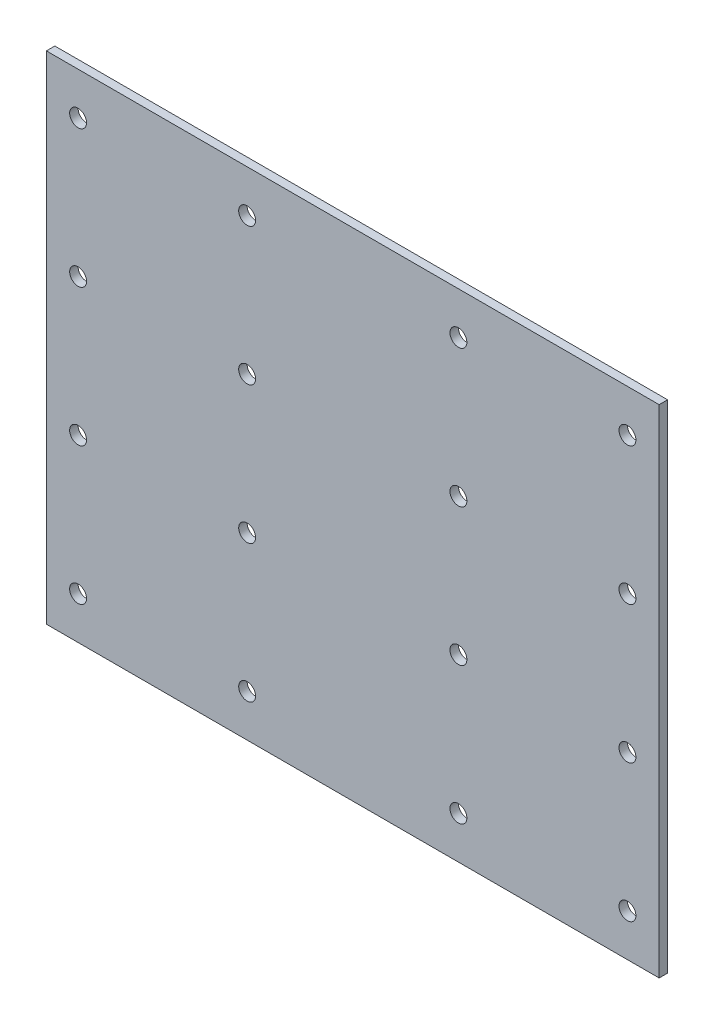
ISO-10303-21;
HEADER;
FILE_DESCRIPTION(('STEP AP214'),'2;1');
FILE_NAME('part.step','',(''),(''),'','','');
FILE_SCHEMA(('AUTOMOTIVE_DESIGN { 1 0 10303 214 1 1 1 1 }'));
ENDSEC;
DATA;
#1=APPLICATION_CONTEXT('core data for automotive mechanical design processes');
#2=APPLICATION_PROTOCOL_DEFINITION('international standard','automotive_design',2000,#1);
#3=PRODUCT_CONTEXT('',#1,'mechanical');
#4=PRODUCT('Part','Part','',(#3));
#5=PRODUCT_RELATED_PRODUCT_CATEGORY('part','',(#4));
#6=PRODUCT_DEFINITION_FORMATION('','',#4);
#7=PRODUCT_DEFINITION_CONTEXT('part definition',#1,'design');
#8=PRODUCT_DEFINITION('design','',#6,#7);
#9=PRODUCT_DEFINITION_SHAPE('','',#8);
#10=(LENGTH_UNIT() NAMED_UNIT(*) SI_UNIT(.MILLI.,.METRE.));
#11=(NAMED_UNIT(*) PLANE_ANGLE_UNIT() SI_UNIT($,.RADIAN.));
#12=(NAMED_UNIT(*) SI_UNIT($,.STERADIAN.) SOLID_ANGLE_UNIT());
#13=UNCERTAINTY_MEASURE_WITH_UNIT(LENGTH_MEASURE(1.E-05),#10,'distance_accuracy_value','');
#14=(GEOMETRIC_REPRESENTATION_CONTEXT(3) GLOBAL_UNCERTAINTY_ASSIGNED_CONTEXT((#13)) GLOBAL_UNIT_ASSIGNED_CONTEXT((#10,
#11,#12)) REPRESENTATION_CONTEXT('',''));
#15=CARTESIAN_POINT('',(0.,0.,0.));
#16=DIRECTION('',(0.,0.,1.));
#17=DIRECTION('',(1.,0.,0.));
#18=AXIS2_PLACEMENT_3D('',#15,#16,#17);
#19=CARTESIAN_POINT('',(0.,0.,2.54));
#20=DIRECTION('',(1.,0.,0.));
#21=DIRECTION('',(0.,1.,0.));
#22=AXIS2_PLACEMENT_3D('',#19,#20,#21);
#23=PLANE('',#22);
#24=DIRECTION('',(0.,-1.,0.));
#25=VECTOR('',#24,1.);
#26=CARTESIAN_POINT('',(0.,0.,0.));
#27=LINE('',#26,#25);
#28=CARTESIAN_POINT('',(0.,0.,0.));
#29=VERTEX_POINT('',#28);
#30=CARTESIAN_POINT('',(0.,-149.225,0.));
#31=VERTEX_POINT('',#30);
#32=EDGE_CURVE('E98',#29,#31,#27,.T.);
#33=ORIENTED_EDGE('',*,*,#32,.T.);
#34=DIRECTION('',(0.,0.,-1.));
#35=VECTOR('',#34,1.);
#36=CARTESIAN_POINT('',(0.,-149.225,2.54));
#37=LINE('',#36,#35);
#38=CARTESIAN_POINT('',(0.,-149.225,2.54));
#39=VERTEX_POINT('',#38);
#40=EDGE_CURVE('E11',#39,#31,#37,.T.);
#41=ORIENTED_EDGE('',*,*,#40,.F.);
#42=DIRECTION('',(0.,-1.,0.));
#43=VECTOR('',#42,1.);
#44=CARTESIAN_POINT('',(0.,0.,2.54));
#45=LINE('',#44,#43);
#46=CARTESIAN_POINT('',(0.,0.,2.54));
#47=VERTEX_POINT('',#46);
#48=EDGE_CURVE('E86',#47,#39,#45,.T.);
#49=ORIENTED_EDGE('',*,*,#48,.F.);
#50=DIRECTION('',(0.,0.,-1.));
#51=VECTOR('',#50,1.);
#52=CARTESIAN_POINT('',(0.,0.,2.54));
#53=LINE('',#52,#51);
#54=EDGE_CURVE('E94',#47,#29,#53,.T.);
#55=ORIENTED_EDGE('',*,*,#54,.T.);
#56=EDGE_LOOP('',(#33,#41,#49,#55));
#57=FACE_BOUND('',#56,.T.);
#58=ADVANCED_FACE('F35',(#57),#23,.F.);
#59=CARTESIAN_POINT('',(0.,-149.225,2.54));
#60=DIRECTION('',(0.,1.,0.));
#61=DIRECTION('',(0.,0.,1.));
#62=AXIS2_PLACEMENT_3D('',#59,#60,#61);
#63=PLANE('',#62);
#64=DIRECTION('',(1.,0.,0.));
#65=VECTOR('',#64,1.);
#66=CARTESIAN_POINT('',(0.,-149.225,0.));
#67=LINE('',#66,#65);
#68=CARTESIAN_POINT('',(184.15,-149.225,0.));
#69=VERTEX_POINT('',#68);
#70=EDGE_CURVE('E90',#31,#69,#67,.T.);
#71=ORIENTED_EDGE('',*,*,#70,.T.);
#72=DIRECTION('',(0.,0.,-1.));
#73=VECTOR('',#72,1.);
#74=CARTESIAN_POINT('',(184.15,-149.225,2.54));
#75=LINE('',#74,#73);
#76=CARTESIAN_POINT('',(184.15,-149.225,2.54));
#77=VERTEX_POINT('',#76);
#78=EDGE_CURVE('E43',#77,#69,#75,.T.);
#79=ORIENTED_EDGE('',*,*,#78,.F.);
#80=DIRECTION('',(1.,0.,0.));
#81=VECTOR('',#80,1.);
#82=CARTESIAN_POINT('',(0.,-149.225,2.54));
#83=LINE('',#82,#81);
#84=EDGE_CURVE('E81',#39,#77,#83,.T.);
#85=ORIENTED_EDGE('',*,*,#84,.F.);
#86=ORIENTED_EDGE('',*,*,#40,.T.);
#87=EDGE_LOOP('',(#71,#79,#85,#86));
#88=FACE_BOUND('',#87,.T.);
#89=ADVANCED_FACE('F89',(#88),#63,.F.);
#90=CARTESIAN_POINT('',(184.15,0.,2.54));
#91=DIRECTION('',(-1.,0.,0.));
#92=DIRECTION('',(0.,-1.,0.));
#93=AXIS2_PLACEMENT_3D('',#90,#91,#92);
#94=PLANE('',#93);
#95=DIRECTION('',(0.,1.,0.));
#96=VECTOR('',#95,1.);
#97=CARTESIAN_POINT('',(184.15,0.,0.));
#98=LINE('',#97,#96);
#99=CARTESIAN_POINT('',(184.15,0.,0.));
#100=VERTEX_POINT('',#99);
#101=EDGE_CURVE('E68',#69,#100,#98,.T.);
#102=ORIENTED_EDGE('',*,*,#101,.T.);
#103=DIRECTION('',(0.,0.,-1.));
#104=VECTOR('',#103,1.);
#105=CARTESIAN_POINT('',(184.15,0.,2.54));
#106=LINE('',#105,#104);
#107=CARTESIAN_POINT('',(184.15,0.,2.54));
#108=VERTEX_POINT('',#107);
#109=EDGE_CURVE('E91',#108,#100,#106,.T.);
#110=ORIENTED_EDGE('',*,*,#109,.F.);
#111=DIRECTION('',(0.,1.,0.));
#112=VECTOR('',#111,1.);
#113=CARTESIAN_POINT('',(184.15,0.,2.54));
#114=LINE('',#113,#112);
#115=EDGE_CURVE('E84',#77,#108,#114,.T.);
#116=ORIENTED_EDGE('',*,*,#115,.F.);
#117=ORIENTED_EDGE('',*,*,#78,.T.);
#118=EDGE_LOOP('',(#102,#110,#116,#117));
#119=FACE_BOUND('',#118,.T.);
#120=ADVANCED_FACE('F92',(#119),#94,.F.);
#121=CARTESIAN_POINT('',(0.,0.,2.54));
#122=DIRECTION('',(0.,-1.,0.));
#123=DIRECTION('',(0.,0.,-1.));
#124=AXIS2_PLACEMENT_3D('',#121,#122,#123);
#125=PLANE('',#124);
#126=DIRECTION('',(-1.,0.,0.));
#127=VECTOR('',#126,1.);
#128=CARTESIAN_POINT('',(0.,0.,0.));
#129=LINE('',#128,#127);
#130=EDGE_CURVE('E74',#100,#29,#129,.T.);
#131=ORIENTED_EDGE('',*,*,#130,.T.);
#132=ORIENTED_EDGE('',*,*,#54,.F.);
#133=DIRECTION('',(-1.,0.,0.));
#134=VECTOR('',#133,1.);
#135=CARTESIAN_POINT('',(0.,0.,2.54));
#136=LINE('',#135,#134);
#137=EDGE_CURVE('E51',#108,#47,#136,.T.);
#138=ORIENTED_EDGE('',*,*,#137,.F.);
#139=ORIENTED_EDGE('',*,*,#109,.T.);
#140=EDGE_LOOP('',(#131,#132,#138,#139));
#141=FACE_BOUND('',#140,.T.);
#142=ADVANCED_FACE('F106',(#141),#125,.F.);
#143=CARTESIAN_POINT('',(0.,0.,2.54));
#144=DIRECTION('',(0.,0.,1.));
#145=DIRECTION('',(1.,0.,0.));
#146=AXIS2_PLACEMENT_3D('',#143,#144,#145);
#147=PLANE('',#146);
#148=CARTESIAN_POINT('',(123.825,-136.525,2.54));
#149=DIRECTION('',(0.,0.,1.));
#150=DIRECTION('',(1.,0.,0.));
#151=AXIS2_PLACEMENT_3D('',#148,#149,#150);
#152=CIRCLE('',#151,2.53999999999998);
#153=CARTESIAN_POINT('',(126.365,-136.525,2.54));
#154=VERTEX_POINT('',#153);
#155=EDGE_CURVE('E202',#154,#154,#152,.T.);
#156=ORIENTED_EDGE('',*,*,#155,.F.);
#157=EDGE_LOOP('',(#156));
#158=FACE_BOUND('',#157,.T.);
#159=CARTESIAN_POINT('',(174.625,-136.525,2.54));
#160=DIRECTION('',(0.,0.,1.));
#161=DIRECTION('',(1.,0.,0.));
#162=AXIS2_PLACEMENT_3D('',#159,#160,#161);
#163=CIRCLE('',#162,2.53999999999998);
#164=CARTESIAN_POINT('',(177.165,-136.525,2.54));
#165=VERTEX_POINT('',#164);
#166=EDGE_CURVE('E196',#165,#165,#163,.T.);
#167=ORIENTED_EDGE('',*,*,#166,.F.);
#168=EDGE_LOOP('',(#167));
#169=FACE_BOUND('',#168,.T.);
#170=CARTESIAN_POINT('',(123.825,-95.25,2.54));
#171=DIRECTION('',(0.,0.,1.));
#172=DIRECTION('',(1.,0.,0.));
#173=AXIS2_PLACEMENT_3D('',#170,#171,#172);
#174=CIRCLE('',#173,2.53999999999998);
#175=CARTESIAN_POINT('',(126.365,-95.25,2.54));
#176=VERTEX_POINT('',#175);
#177=EDGE_CURVE('E191',#176,#176,#174,.T.);
#178=ORIENTED_EDGE('',*,*,#177,.F.);
#179=EDGE_LOOP('',(#178));
#180=FACE_BOUND('',#179,.T.);
#181=CARTESIAN_POINT('',(174.625,-95.25,2.54));
#182=DIRECTION('',(0.,0.,1.));
#183=DIRECTION('',(1.,0.,0.));
#184=AXIS2_PLACEMENT_3D('',#181,#182,#183);
#185=CIRCLE('',#184,2.53999999999998);
#186=CARTESIAN_POINT('',(177.165,-95.25,2.54));
#187=VERTEX_POINT('',#186);
#188=EDGE_CURVE('E184',#187,#187,#185,.T.);
#189=ORIENTED_EDGE('',*,*,#188,.F.);
#190=EDGE_LOOP('',(#189));
#191=FACE_BOUND('',#190,.T.);
#192=CARTESIAN_POINT('',(60.325,-136.525,2.54));
#193=DIRECTION('',(0.,0.,1.));
#194=DIRECTION('',(1.,0.,0.));
#195=AXIS2_PLACEMENT_3D('',#192,#193,#194);
#196=CIRCLE('',#195,2.54000000000001);
#197=CARTESIAN_POINT('',(62.865,-136.525,2.54));
#198=VERTEX_POINT('',#197);
#199=EDGE_CURVE('E179',#198,#198,#196,.T.);
#200=ORIENTED_EDGE('',*,*,#199,.F.);
#201=EDGE_LOOP('',(#200));
#202=FACE_BOUND('',#201,.T.);
#203=CARTESIAN_POINT('',(60.325,-95.25,2.54));
#204=DIRECTION('',(0.,0.,1.));
#205=DIRECTION('',(1.,0.,0.));
#206=AXIS2_PLACEMENT_3D('',#203,#204,#205);
#207=CIRCLE('',#206,2.54000000000001);
#208=CARTESIAN_POINT('',(62.865,-95.25,2.54));
#209=VERTEX_POINT('',#208);
#210=EDGE_CURVE('E172',#209,#209,#207,.T.);
#211=ORIENTED_EDGE('',*,*,#210,.F.);
#212=EDGE_LOOP('',(#211));
#213=FACE_BOUND('',#212,.T.);
#214=CARTESIAN_POINT('',(9.525,-95.25,2.54));
#215=DIRECTION('',(0.,0.,1.));
#216=DIRECTION('',(1.,0.,0.));
#217=AXIS2_PLACEMENT_3D('',#214,#215,#216);
#218=CIRCLE('',#217,2.54000000000001);
#219=CARTESIAN_POINT('',(12.065,-95.25,2.54));
#220=VERTEX_POINT('',#219);
#221=EDGE_CURVE('E166',#220,#220,#218,.T.);
#222=ORIENTED_EDGE('',*,*,#221,.F.);
#223=EDGE_LOOP('',(#222));
#224=FACE_BOUND('',#223,.T.);
#225=CARTESIAN_POINT('',(9.525,-136.525,2.54));
#226=DIRECTION('',(0.,0.,1.));
#227=DIRECTION('',(1.,0.,0.));
#228=AXIS2_PLACEMENT_3D('',#225,#226,#227);
#229=CIRCLE('',#228,2.54000000000001);
#230=CARTESIAN_POINT('',(12.065,-136.525,2.54));
#231=VERTEX_POINT('',#230);
#232=EDGE_CURVE('E160',#231,#231,#229,.T.);
#233=ORIENTED_EDGE('',*,*,#232,.F.);
#234=EDGE_LOOP('',(#233));
#235=FACE_BOUND('',#234,.T.);
#236=CARTESIAN_POINT('',(123.825,-53.975,2.54));
#237=DIRECTION('',(0.,0.,1.));
#238=DIRECTION('',(1.,0.,0.));
#239=AXIS2_PLACEMENT_3D('',#236,#237,#238);
#240=CIRCLE('',#239,2.53999999999998);
#241=CARTESIAN_POINT('',(126.365,-53.975,2.54));
#242=VERTEX_POINT('',#241);
#243=EDGE_CURVE('E155',#242,#242,#240,.T.);
#244=ORIENTED_EDGE('',*,*,#243,.F.);
#245=EDGE_LOOP('',(#244));
#246=FACE_BOUND('',#245,.T.);
#247=CARTESIAN_POINT('',(174.625,-53.975,2.54));
#248=DIRECTION('',(0.,0.,1.));
#249=DIRECTION('',(1.,0.,0.));
#250=AXIS2_PLACEMENT_3D('',#247,#248,#249);
#251=CIRCLE('',#250,2.53999999999998);
#252=CARTESIAN_POINT('',(177.165,-53.975,2.54));
#253=VERTEX_POINT('',#252);
#254=EDGE_CURVE('E148',#253,#253,#251,.T.);
#255=ORIENTED_EDGE('',*,*,#254,.F.);
#256=EDGE_LOOP('',(#255));
#257=FACE_BOUND('',#256,.T.);
#258=CARTESIAN_POINT('',(174.625,-12.7,2.54));
#259=DIRECTION('',(0.,0.,1.));
#260=DIRECTION('',(1.,0.,0.));
#261=AXIS2_PLACEMENT_3D('',#258,#259,#260);
#262=CIRCLE('',#261,2.53999999999998);
#263=CARTESIAN_POINT('',(177.165,-12.7,2.54));
#264=VERTEX_POINT('',#263);
#265=EDGE_CURVE('E142',#264,#264,#262,.T.);
#266=ORIENTED_EDGE('',*,*,#265,.F.);
#267=EDGE_LOOP('',(#266));
#268=FACE_BOUND('',#267,.T.);
#269=CARTESIAN_POINT('',(123.825,-12.7,2.54));
#270=DIRECTION('',(0.,0.,1.));
#271=DIRECTION('',(1.,0.,0.));
#272=AXIS2_PLACEMENT_3D('',#269,#270,#271);
#273=CIRCLE('',#272,2.53999999999998);
#274=CARTESIAN_POINT('',(126.365,-12.7,2.54));
#275=VERTEX_POINT('',#274);
#276=EDGE_CURVE('E136',#275,#275,#273,.T.);
#277=ORIENTED_EDGE('',*,*,#276,.F.);
#278=EDGE_LOOP('',(#277));
#279=FACE_BOUND('',#278,.T.);
#280=CARTESIAN_POINT('',(9.52500000000001,-53.975,2.54));
#281=DIRECTION('',(0.,0.,1.));
#282=DIRECTION('',(1.,0.,0.));
#283=AXIS2_PLACEMENT_3D('',#280,#281,#282);
#284=CIRCLE('',#283,2.54);
#285=CARTESIAN_POINT('',(12.065,-53.975,2.54));
#286=VERTEX_POINT('',#285);
#287=EDGE_CURVE('E131',#286,#286,#284,.T.);
#288=ORIENTED_EDGE('',*,*,#287,.F.);
#289=EDGE_LOOP('',(#288));
#290=FACE_BOUND('',#289,.T.);
#291=CARTESIAN_POINT('',(60.325,-53.975,2.54));
#292=DIRECTION('',(0.,0.,1.));
#293=DIRECTION('',(1.,0.,0.));
#294=AXIS2_PLACEMENT_3D('',#291,#292,#293);
#295=CIRCLE('',#294,2.54);
#296=CARTESIAN_POINT('',(62.865,-53.975,2.54));
#297=VERTEX_POINT('',#296);
#298=EDGE_CURVE('E124',#297,#297,#295,.T.);
#299=ORIENTED_EDGE('',*,*,#298,.F.);
#300=EDGE_LOOP('',(#299));
#301=FACE_BOUND('',#300,.T.);
#302=CARTESIAN_POINT('',(60.325,-12.7,2.54));
#303=DIRECTION('',(0.,0.,1.));
#304=DIRECTION('',(1.,0.,0.));
#305=AXIS2_PLACEMENT_3D('',#302,#303,#304);
#306=CIRCLE('',#305,2.54);
#307=CARTESIAN_POINT('',(62.865,-12.7,2.54));
#308=VERTEX_POINT('',#307);
#309=EDGE_CURVE('E118',#308,#308,#306,.T.);
#310=ORIENTED_EDGE('',*,*,#309,.F.);
#311=EDGE_LOOP('',(#310));
#312=FACE_BOUND('',#311,.T.);
#313=CARTESIAN_POINT('',(9.525,-12.7,2.54));
#314=DIRECTION('',(0.,0.,1.));
#315=DIRECTION('',(1.,0.,0.));
#316=AXIS2_PLACEMENT_3D('',#313,#314,#315);
#317=CIRCLE('',#316,2.54);
#318=CARTESIAN_POINT('',(12.065,-12.7,2.54));
#319=VERTEX_POINT('',#318);
#320=EDGE_CURVE('E112',#319,#319,#317,.T.);
#321=ORIENTED_EDGE('',*,*,#320,.F.);
#322=EDGE_LOOP('',(#321));
#323=FACE_BOUND('',#322,.T.);
#324=ORIENTED_EDGE('',*,*,#48,.T.);
#325=ORIENTED_EDGE('',*,*,#84,.T.);
#326=ORIENTED_EDGE('',*,*,#115,.T.);
#327=ORIENTED_EDGE('',*,*,#137,.T.);
#328=EDGE_LOOP('',(#324,#325,#326,#327));
#329=FACE_BOUND('',#328,.T.);
#330=ADVANCED_FACE('F82',(#158,#169,#180,#191,#202,#213,#224,#235,#246,#257,#268,#279,#290,#301,
#312,#323,#329),#147,.T.);
#331=CARTESIAN_POINT('',(0.,0.,0.));
#332=DIRECTION('',(0.,0.,1.));
#333=DIRECTION('',(1.,0.,0.));
#334=AXIS2_PLACEMENT_3D('',#331,#332,#333);
#335=PLANE('',#334);
#336=CARTESIAN_POINT('',(123.825,-136.525,0.));
#337=DIRECTION('',(0.,0.,1.));
#338=DIRECTION('',(1.,0.,0.));
#339=AXIS2_PLACEMENT_3D('',#336,#337,#338);
#340=CIRCLE('',#339,2.53999999999998);
#341=CARTESIAN_POINT('',(126.365,-136.525,0.));
#342=VERTEX_POINT('',#341);
#343=EDGE_CURVE('E188',#342,#342,#340,.T.);
#344=ORIENTED_EDGE('',*,*,#343,.T.);
#345=EDGE_LOOP('',(#344));
#346=FACE_BOUND('',#345,.T.);
#347=CARTESIAN_POINT('',(174.625,-136.525,0.));
#348=DIRECTION('',(0.,0.,1.));
#349=DIRECTION('',(1.,0.,0.));
#350=AXIS2_PLACEMENT_3D('',#347,#348,#349);
#351=CIRCLE('',#350,2.53999999999998);
#352=CARTESIAN_POINT('',(177.165,-136.525,0.));
#353=VERTEX_POINT('',#352);
#354=EDGE_CURVE('E199',#353,#353,#351,.T.);
#355=ORIENTED_EDGE('',*,*,#354,.T.);
#356=EDGE_LOOP('',(#355));
#357=FACE_BOUND('',#356,.T.);
#358=CARTESIAN_POINT('',(123.825,-95.25,0.));
#359=DIRECTION('',(0.,0.,1.));
#360=DIRECTION('',(1.,0.,0.));
#361=AXIS2_PLACEMENT_3D('',#358,#359,#360);
#362=CIRCLE('',#361,2.53999999999998);
#363=CARTESIAN_POINT('',(126.365,-95.25,0.));
#364=VERTEX_POINT('',#363);
#365=EDGE_CURVE('E176',#364,#364,#362,.T.);
#366=ORIENTED_EDGE('',*,*,#365,.T.);
#367=EDGE_LOOP('',(#366));
#368=FACE_BOUND('',#367,.T.);
#369=CARTESIAN_POINT('',(174.625,-95.25,0.));
#370=DIRECTION('',(0.,0.,1.));
#371=DIRECTION('',(1.,0.,0.));
#372=AXIS2_PLACEMENT_3D('',#369,#370,#371);
#373=CIRCLE('',#372,2.53999999999998);
#374=CARTESIAN_POINT('',(177.165,-95.25,0.));
#375=VERTEX_POINT('',#374);
#376=EDGE_CURVE('E187',#375,#375,#373,.T.);
#377=ORIENTED_EDGE('',*,*,#376,.T.);
#378=EDGE_LOOP('',(#377));
#379=FACE_BOUND('',#378,.T.);
#380=CARTESIAN_POINT('',(60.325,-136.525,0.));
#381=DIRECTION('',(0.,0.,1.));
#382=DIRECTION('',(1.,0.,0.));
#383=AXIS2_PLACEMENT_3D('',#380,#381,#382);
#384=CIRCLE('',#383,2.54000000000001);
#385=CARTESIAN_POINT('',(62.865,-136.525,0.));
#386=VERTEX_POINT('',#385);
#387=EDGE_CURVE('E169',#386,#386,#384,.T.);
#388=ORIENTED_EDGE('',*,*,#387,.T.);
#389=EDGE_LOOP('',(#388));
#390=FACE_BOUND('',#389,.T.);
#391=CARTESIAN_POINT('',(60.325,-95.25,0.));
#392=DIRECTION('',(0.,0.,1.));
#393=DIRECTION('',(1.,0.,0.));
#394=AXIS2_PLACEMENT_3D('',#391,#392,#393);
#395=CIRCLE('',#394,2.54000000000001);
#396=CARTESIAN_POINT('',(62.865,-95.25,0.));
#397=VERTEX_POINT('',#396);
#398=EDGE_CURVE('E175',#397,#397,#395,.T.);
#399=ORIENTED_EDGE('',*,*,#398,.T.);
#400=EDGE_LOOP('',(#399));
#401=FACE_BOUND('',#400,.T.);
#402=CARTESIAN_POINT('',(9.525,-95.25,0.));
#403=DIRECTION('',(0.,0.,1.));
#404=DIRECTION('',(1.,0.,0.));
#405=AXIS2_PLACEMENT_3D('',#402,#403,#404);
#406=CIRCLE('',#405,2.54000000000001);
#407=CARTESIAN_POINT('',(12.065,-95.25,0.));
#408=VERTEX_POINT('',#407);
#409=EDGE_CURVE('E163',#408,#408,#406,.T.);
#410=ORIENTED_EDGE('',*,*,#409,.T.);
#411=EDGE_LOOP('',(#410));
#412=FACE_BOUND('',#411,.T.);
#413=CARTESIAN_POINT('',(9.525,-136.525,0.));
#414=DIRECTION('',(0.,0.,1.));
#415=DIRECTION('',(1.,0.,0.));
#416=AXIS2_PLACEMENT_3D('',#413,#414,#415);
#417=CIRCLE('',#416,2.54000000000001);
#418=CARTESIAN_POINT('',(12.065,-136.525,0.));
#419=VERTEX_POINT('',#418);
#420=EDGE_CURVE('E152',#419,#419,#417,.T.);
#421=ORIENTED_EDGE('',*,*,#420,.T.);
#422=EDGE_LOOP('',(#421));
#423=FACE_BOUND('',#422,.T.);
#424=CARTESIAN_POINT('',(123.825,-53.975,0.));
#425=DIRECTION('',(0.,0.,1.));
#426=DIRECTION('',(1.,0.,0.));
#427=AXIS2_PLACEMENT_3D('',#424,#425,#426);
#428=CIRCLE('',#427,2.53999999999998);
#429=CARTESIAN_POINT('',(126.365,-53.975,0.));
#430=VERTEX_POINT('',#429);
#431=EDGE_CURVE('E145',#430,#430,#428,.T.);
#432=ORIENTED_EDGE('',*,*,#431,.T.);
#433=EDGE_LOOP('',(#432));
#434=FACE_BOUND('',#433,.T.);
#435=CARTESIAN_POINT('',(174.625,-53.975,0.));
#436=DIRECTION('',(0.,0.,1.));
#437=DIRECTION('',(1.,0.,0.));
#438=AXIS2_PLACEMENT_3D('',#435,#436,#437);
#439=CIRCLE('',#438,2.53999999999998);
#440=CARTESIAN_POINT('',(177.165,-53.975,0.));
#441=VERTEX_POINT('',#440);
#442=EDGE_CURVE('E151',#441,#441,#439,.T.);
#443=ORIENTED_EDGE('',*,*,#442,.T.);
#444=EDGE_LOOP('',(#443));
#445=FACE_BOUND('',#444,.T.);
#446=CARTESIAN_POINT('',(174.625,-12.7,0.));
#447=DIRECTION('',(0.,0.,1.));
#448=DIRECTION('',(1.,0.,0.));
#449=AXIS2_PLACEMENT_3D('',#446,#447,#448);
#450=CIRCLE('',#449,2.53999999999998);
#451=CARTESIAN_POINT('',(177.165,-12.7,0.));
#452=VERTEX_POINT('',#451);
#453=EDGE_CURVE('E139',#452,#452,#450,.T.);
#454=ORIENTED_EDGE('',*,*,#453,.T.);
#455=EDGE_LOOP('',(#454));
#456=FACE_BOUND('',#455,.T.);
#457=CARTESIAN_POINT('',(123.825,-12.7,0.));
#458=DIRECTION('',(0.,0.,1.));
#459=DIRECTION('',(1.,0.,0.));
#460=AXIS2_PLACEMENT_3D('',#457,#458,#459);
#461=CIRCLE('',#460,2.53999999999998);
#462=CARTESIAN_POINT('',(126.365,-12.7,0.));
#463=VERTEX_POINT('',#462);
#464=EDGE_CURVE('E128',#463,#463,#461,.T.);
#465=ORIENTED_EDGE('',*,*,#464,.T.);
#466=EDGE_LOOP('',(#465));
#467=FACE_BOUND('',#466,.T.);
#468=CARTESIAN_POINT('',(9.52500000000001,-53.975,0.));
#469=DIRECTION('',(0.,0.,1.));
#470=DIRECTION('',(1.,0.,0.));
#471=AXIS2_PLACEMENT_3D('',#468,#469,#470);
#472=CIRCLE('',#471,2.54);
#473=CARTESIAN_POINT('',(12.065,-53.975,0.));
#474=VERTEX_POINT('',#473);
#475=EDGE_CURVE('E121',#474,#474,#472,.T.);
#476=ORIENTED_EDGE('',*,*,#475,.T.);
#477=EDGE_LOOP('',(#476));
#478=FACE_BOUND('',#477,.T.);
#479=CARTESIAN_POINT('',(60.325,-53.975,0.));
#480=DIRECTION('',(0.,0.,1.));
#481=DIRECTION('',(1.,0.,0.));
#482=AXIS2_PLACEMENT_3D('',#479,#480,#481);
#483=CIRCLE('',#482,2.54);
#484=CARTESIAN_POINT('',(62.865,-53.975,0.));
#485=VERTEX_POINT('',#484);
#486=EDGE_CURVE('E127',#485,#485,#483,.T.);
#487=ORIENTED_EDGE('',*,*,#486,.T.);
#488=EDGE_LOOP('',(#487));
#489=FACE_BOUND('',#488,.T.);
#490=CARTESIAN_POINT('',(60.325,-12.7,0.));
#491=DIRECTION('',(0.,0.,1.));
#492=DIRECTION('',(1.,0.,0.));
#493=AXIS2_PLACEMENT_3D('',#490,#491,#492);
#494=CIRCLE('',#493,2.54);
#495=CARTESIAN_POINT('',(62.865,-12.7,0.));
#496=VERTEX_POINT('',#495);
#497=EDGE_CURVE('E115',#496,#496,#494,.T.);
#498=ORIENTED_EDGE('',*,*,#497,.T.);
#499=EDGE_LOOP('',(#498));
#500=FACE_BOUND('',#499,.T.);
#501=CARTESIAN_POINT('',(9.525,-12.7,0.));
#502=DIRECTION('',(0.,0.,1.));
#503=DIRECTION('',(1.,0.,0.));
#504=AXIS2_PLACEMENT_3D('',#501,#502,#503);
#505=CIRCLE('',#504,2.54);
#506=CARTESIAN_POINT('',(12.065,-12.7,0.));
#507=VERTEX_POINT('',#506);
#508=EDGE_CURVE('E101',#507,#507,#505,.T.);
#509=ORIENTED_EDGE('',*,*,#508,.T.);
#510=EDGE_LOOP('',(#509));
#511=FACE_BOUND('',#510,.T.);
#512=ORIENTED_EDGE('',*,*,#32,.F.);
#513=ORIENTED_EDGE('',*,*,#130,.F.);
#514=ORIENTED_EDGE('',*,*,#101,.F.);
#515=ORIENTED_EDGE('',*,*,#70,.F.);
#516=EDGE_LOOP('',(#512,#513,#514,#515));
#517=FACE_BOUND('',#516,.T.);
#518=ADVANCED_FACE('F109',(#346,#357,#368,#379,#390,#401,#412,#423,#434,#445,#456,#467,#478,
#489,#500,#511,#517),#335,.F.);
#519=CARTESIAN_POINT('',(9.525,-12.7,0.));
#520=DIRECTION('',(0.,0.,1.));
#521=DIRECTION('',(1.,0.,0.));
#522=AXIS2_PLACEMENT_3D('',#519,#520,#521);
#523=CYLINDRICAL_SURFACE('',#522,2.54);
#524=ORIENTED_EDGE('',*,*,#508,.F.);
#525=EDGE_LOOP('',(#524));
#526=FACE_BOUND('',#525,.T.);
#527=ORIENTED_EDGE('',*,*,#320,.T.);
#528=EDGE_LOOP('',(#527));
#529=FACE_BOUND('',#528,.T.);
#530=ADVANCED_FACE('F250',(#526,#529),#523,.F.);
#531=CARTESIAN_POINT('',(60.325,-12.7,0.));
#532=DIRECTION('',(0.,0.,1.));
#533=DIRECTION('',(1.,0.,0.));
#534=AXIS2_PLACEMENT_3D('',#531,#532,#533);
#535=CYLINDRICAL_SURFACE('',#534,2.54);
#536=ORIENTED_EDGE('',*,*,#497,.F.);
#537=EDGE_LOOP('',(#536));
#538=FACE_BOUND('',#537,.T.);
#539=ORIENTED_EDGE('',*,*,#309,.T.);
#540=EDGE_LOOP('',(#539));
#541=FACE_BOUND('',#540,.T.);
#542=ADVANCED_FACE('F252',(#538,#541),#535,.F.);
#543=CARTESIAN_POINT('',(60.325,-53.975,0.));
#544=DIRECTION('',(0.,0.,1.));
#545=DIRECTION('',(1.,0.,0.));
#546=AXIS2_PLACEMENT_3D('',#543,#544,#545);
#547=CYLINDRICAL_SURFACE('',#546,2.54);
#548=ORIENTED_EDGE('',*,*,#486,.F.);
#549=EDGE_LOOP('',(#548));
#550=FACE_BOUND('',#549,.T.);
#551=ORIENTED_EDGE('',*,*,#298,.T.);
#552=EDGE_LOOP('',(#551));
#553=FACE_BOUND('',#552,.T.);
#554=ADVANCED_FACE('F259',(#550,#553),#547,.F.);
#555=CARTESIAN_POINT('',(9.52500000000001,-53.975,0.));
#556=DIRECTION('',(0.,0.,1.));
#557=DIRECTION('',(1.,0.,0.));
#558=AXIS2_PLACEMENT_3D('',#555,#556,#557);
#559=CYLINDRICAL_SURFACE('',#558,2.54);
#560=ORIENTED_EDGE('',*,*,#475,.F.);
#561=EDGE_LOOP('',(#560));
#562=FACE_BOUND('',#561,.T.);
#563=ORIENTED_EDGE('',*,*,#287,.T.);
#564=EDGE_LOOP('',(#563));
#565=FACE_BOUND('',#564,.T.);
#566=ADVANCED_FACE('F362',(#562,#565),#559,.F.);
#567=CARTESIAN_POINT('',(123.825,-12.7,0.));
#568=DIRECTION('',(0.,0.,1.));
#569=DIRECTION('',(1.,0.,0.));
#570=AXIS2_PLACEMENT_3D('',#567,#568,#569);
#571=CYLINDRICAL_SURFACE('',#570,2.53999999999998);
#572=ORIENTED_EDGE('',*,*,#464,.F.);
#573=EDGE_LOOP('',(#572));
#574=FACE_BOUND('',#573,.T.);
#575=ORIENTED_EDGE('',*,*,#276,.T.);
#576=EDGE_LOOP('',(#575));
#577=FACE_BOUND('',#576,.T.);
#578=ADVANCED_FACE('F358',(#574,#577),#571,.F.);
#579=CARTESIAN_POINT('',(174.625,-12.7,0.));
#580=DIRECTION('',(0.,0.,1.));
#581=DIRECTION('',(1.,0.,0.));
#582=AXIS2_PLACEMENT_3D('',#579,#580,#581);
#583=CYLINDRICAL_SURFACE('',#582,2.53999999999998);
#584=ORIENTED_EDGE('',*,*,#453,.F.);
#585=EDGE_LOOP('',(#584));
#586=FACE_BOUND('',#585,.T.);
#587=ORIENTED_EDGE('',*,*,#265,.T.);
#588=EDGE_LOOP('',(#587));
#589=FACE_BOUND('',#588,.T.);
#590=ADVANCED_FACE('F354',(#586,#589),#583,.F.);
#591=CARTESIAN_POINT('',(174.625,-53.975,0.));
#592=DIRECTION('',(0.,0.,1.));
#593=DIRECTION('',(1.,0.,0.));
#594=AXIS2_PLACEMENT_3D('',#591,#592,#593);
#595=CYLINDRICAL_SURFACE('',#594,2.53999999999998);
#596=ORIENTED_EDGE('',*,*,#442,.F.);
#597=EDGE_LOOP('',(#596));
#598=FACE_BOUND('',#597,.T.);
#599=ORIENTED_EDGE('',*,*,#254,.T.);
#600=EDGE_LOOP('',(#599));
#601=FACE_BOUND('',#600,.T.);
#602=ADVANCED_FACE('F350',(#598,#601),#595,.F.);
#603=CARTESIAN_POINT('',(123.825,-53.975,0.));
#604=DIRECTION('',(0.,0.,1.));
#605=DIRECTION('',(1.,0.,0.));
#606=AXIS2_PLACEMENT_3D('',#603,#604,#605);
#607=CYLINDRICAL_SURFACE('',#606,2.53999999999998);
#608=ORIENTED_EDGE('',*,*,#431,.F.);
#609=EDGE_LOOP('',(#608));
#610=FACE_BOUND('',#609,.T.);
#611=ORIENTED_EDGE('',*,*,#243,.T.);
#612=EDGE_LOOP('',(#611));
#613=FACE_BOUND('',#612,.T.);
#614=ADVANCED_FACE('F346',(#610,#613),#607,.F.);
#615=CARTESIAN_POINT('',(9.525,-136.525,0.));
#616=DIRECTION('',(0.,0.,1.));
#617=DIRECTION('',(1.,0.,0.));
#618=AXIS2_PLACEMENT_3D('',#615,#616,#617);
#619=CYLINDRICAL_SURFACE('',#618,2.54000000000001);
#620=ORIENTED_EDGE('',*,*,#420,.F.);
#621=EDGE_LOOP('',(#620));
#622=FACE_BOUND('',#621,.T.);
#623=ORIENTED_EDGE('',*,*,#232,.T.);
#624=EDGE_LOOP('',(#623));
#625=FACE_BOUND('',#624,.T.);
#626=ADVANCED_FACE('F342',(#622,#625),#619,.F.);
#627=CARTESIAN_POINT('',(9.525,-95.25,0.));
#628=DIRECTION('',(0.,0.,1.));
#629=DIRECTION('',(1.,0.,0.));
#630=AXIS2_PLACEMENT_3D('',#627,#628,#629);
#631=CYLINDRICAL_SURFACE('',#630,2.54000000000001);
#632=ORIENTED_EDGE('',*,*,#409,.F.);
#633=EDGE_LOOP('',(#632));
#634=FACE_BOUND('',#633,.T.);
#635=ORIENTED_EDGE('',*,*,#221,.T.);
#636=EDGE_LOOP('',(#635));
#637=FACE_BOUND('',#636,.T.);
#638=ADVANCED_FACE('F338',(#634,#637),#631,.F.);
#639=CARTESIAN_POINT('',(60.325,-95.25,0.));
#640=DIRECTION('',(0.,0.,1.));
#641=DIRECTION('',(1.,0.,0.));
#642=AXIS2_PLACEMENT_3D('',#639,#640,#641);
#643=CYLINDRICAL_SURFACE('',#642,2.54000000000001);
#644=ORIENTED_EDGE('',*,*,#398,.F.);
#645=EDGE_LOOP('',(#644));
#646=FACE_BOUND('',#645,.T.);
#647=ORIENTED_EDGE('',*,*,#210,.T.);
#648=EDGE_LOOP('',(#647));
#649=FACE_BOUND('',#648,.T.);
#650=ADVANCED_FACE('F334',(#646,#649),#643,.F.);
#651=CARTESIAN_POINT('',(60.325,-136.525,0.));
#652=DIRECTION('',(0.,0.,1.));
#653=DIRECTION('',(1.,0.,0.));
#654=AXIS2_PLACEMENT_3D('',#651,#652,#653);
#655=CYLINDRICAL_SURFACE('',#654,2.54000000000001);
#656=ORIENTED_EDGE('',*,*,#387,.F.);
#657=EDGE_LOOP('',(#656));
#658=FACE_BOUND('',#657,.T.);
#659=ORIENTED_EDGE('',*,*,#199,.T.);
#660=EDGE_LOOP('',(#659));
#661=FACE_BOUND('',#660,.T.);
#662=ADVANCED_FACE('F299',(#658,#661),#655,.F.);
#663=CARTESIAN_POINT('',(174.625,-95.25,0.));
#664=DIRECTION('',(0.,0.,1.));
#665=DIRECTION('',(1.,0.,0.));
#666=AXIS2_PLACEMENT_3D('',#663,#664,#665);
#667=CYLINDRICAL_SURFACE('',#666,2.53999999999998);
#668=ORIENTED_EDGE('',*,*,#376,.F.);
#669=EDGE_LOOP('',(#668));
#670=FACE_BOUND('',#669,.T.);
#671=ORIENTED_EDGE('',*,*,#188,.T.);
#672=EDGE_LOOP('',(#671));
#673=FACE_BOUND('',#672,.T.);
#674=ADVANCED_FACE('F293',(#670,#673),#667,.F.);
#675=CARTESIAN_POINT('',(123.825,-95.25,0.));
#676=DIRECTION('',(0.,0.,1.));
#677=DIRECTION('',(1.,0.,0.));
#678=AXIS2_PLACEMENT_3D('',#675,#676,#677);
#679=CYLINDRICAL_SURFACE('',#678,2.53999999999998);
#680=ORIENTED_EDGE('',*,*,#365,.F.);
#681=EDGE_LOOP('',(#680));
#682=FACE_BOUND('',#681,.T.);
#683=ORIENTED_EDGE('',*,*,#177,.T.);
#684=EDGE_LOOP('',(#683));
#685=FACE_BOUND('',#684,.T.);
#686=ADVANCED_FACE('F298',(#682,#685),#679,.F.);
#687=CARTESIAN_POINT('',(174.625,-136.525,0.));
#688=DIRECTION('',(0.,0.,1.));
#689=DIRECTION('',(1.,0.,0.));
#690=AXIS2_PLACEMENT_3D('',#687,#688,#689);
#691=CYLINDRICAL_SURFACE('',#690,2.53999999999998);
#692=ORIENTED_EDGE('',*,*,#354,.F.);
#693=EDGE_LOOP('',(#692));
#694=FACE_BOUND('',#693,.T.);
#695=ORIENTED_EDGE('',*,*,#166,.T.);
#696=EDGE_LOOP('',(#695));
#697=FACE_BOUND('',#696,.T.);
#698=ADVANCED_FACE('F213',(#694,#697),#691,.F.);
#699=CARTESIAN_POINT('',(123.825,-136.525,0.));
#700=DIRECTION('',(0.,0.,1.));
#701=DIRECTION('',(1.,0.,0.));
#702=AXIS2_PLACEMENT_3D('',#699,#700,#701);
#703=CYLINDRICAL_SURFACE('',#702,2.53999999999998);
#704=ORIENTED_EDGE('',*,*,#343,.F.);
#705=EDGE_LOOP('',(#704));
#706=FACE_BOUND('',#705,.T.);
#707=ORIENTED_EDGE('',*,*,#155,.T.);
#708=EDGE_LOOP('',(#707));
#709=FACE_BOUND('',#708,.T.);
#710=ADVANCED_FACE('F210',(#706,#709),#703,.F.);
#711=CLOSED_SHELL('',(#58,#89,#120,#142,#330,#518,#530,#542,#554,#566,#578,#590,#602,#614,#626,
#638,#650,#662,#674,#686,#698,#710));
#712=MANIFOLD_SOLID_BREP('B2',#711);
#713=ADVANCED_BREP_SHAPE_REPRESENTATION('',(#18,#712),#14);
#714=SHAPE_DEFINITION_REPRESENTATION(#9,#713);
ENDSEC;
END-ISO-10303-21;
